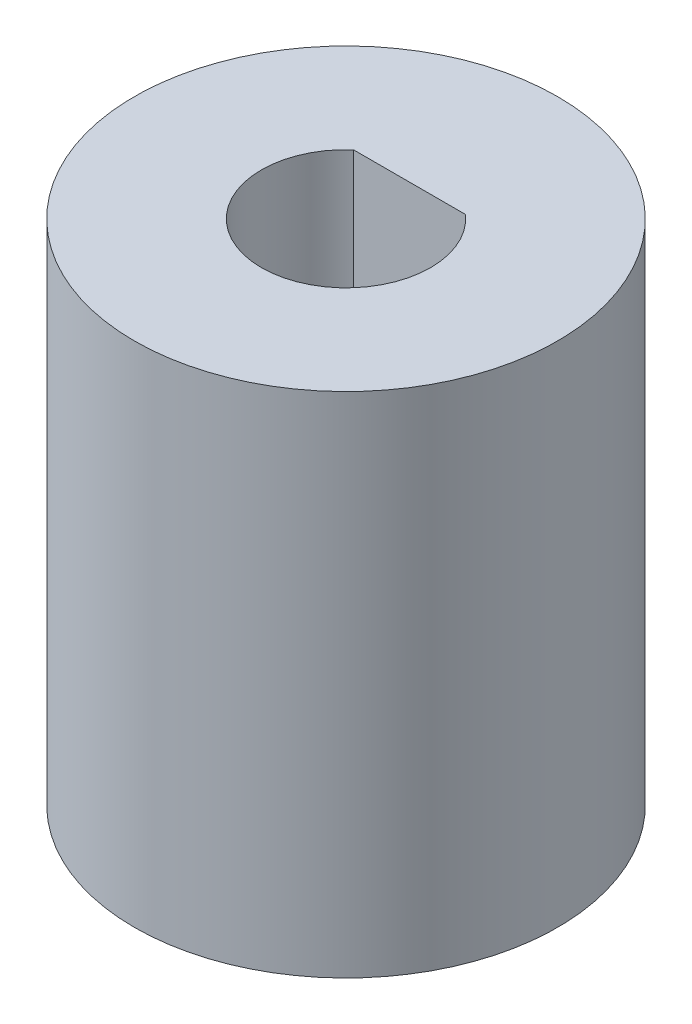
ISO-10303-21;
HEADER;
FILE_DESCRIPTION(('STEP AP214'),'2;1');
FILE_NAME('part.step','',(''),(''),'','','');
FILE_SCHEMA(('AUTOMOTIVE_DESIGN { 1 0 10303 214 1 1 1 1 }'));
ENDSEC;
DATA;
#1=APPLICATION_CONTEXT('core data for automotive mechanical design processes');
#2=APPLICATION_PROTOCOL_DEFINITION('international standard','automotive_design',2000,#1);
#3=PRODUCT_CONTEXT('',#1,'mechanical');
#4=PRODUCT('Part','Part','',(#3));
#5=PRODUCT_RELATED_PRODUCT_CATEGORY('part','',(#4));
#6=PRODUCT_DEFINITION_FORMATION('','',#4);
#7=PRODUCT_DEFINITION_CONTEXT('part definition',#1,'design');
#8=PRODUCT_DEFINITION('design','',#6,#7);
#9=PRODUCT_DEFINITION_SHAPE('','',#8);
#10=(LENGTH_UNIT() NAMED_UNIT(*) SI_UNIT(.MILLI.,.METRE.));
#11=(NAMED_UNIT(*) PLANE_ANGLE_UNIT() SI_UNIT($,.RADIAN.));
#12=(NAMED_UNIT(*) SI_UNIT($,.STERADIAN.) SOLID_ANGLE_UNIT());
#13=UNCERTAINTY_MEASURE_WITH_UNIT(LENGTH_MEASURE(1.E-05),#10,'distance_accuracy_value','');
#14=(GEOMETRIC_REPRESENTATION_CONTEXT(3) GLOBAL_UNCERTAINTY_ASSIGNED_CONTEXT((#13)) GLOBAL_UNIT_ASSIGNED_CONTEXT((#10,
#11,#12)) REPRESENTATION_CONTEXT('',''));
#15=CARTESIAN_POINT('',(0.,0.,0.));
#16=DIRECTION('',(0.,0.,1.));
#17=DIRECTION('',(1.,0.,0.));
#18=AXIS2_PLACEMENT_3D('',#15,#16,#17);
#19=CARTESIAN_POINT('',(0.,12.,0.));
#20=DIRECTION('',(0.,1.,0.));
#21=DIRECTION('',(0.,0.,1.));
#22=AXIS2_PLACEMENT_3D('',#19,#20,#21);
#23=PLANE('',#22);
#24=CARTESIAN_POINT('',(0.,12.,0.));
#25=DIRECTION('',(0.,1.,0.));
#26=DIRECTION('',(0.,0.,1.));
#27=AXIS2_PLACEMENT_3D('',#24,#25,#26);
#28=CIRCLE('',#27,5.);
#29=CARTESIAN_POINT('',(0.,12.,5.));
#30=VERTEX_POINT('',#29);
#31=EDGE_CURVE('E11',#30,#30,#28,.T.);
#32=ORIENTED_EDGE('',*,*,#31,.T.);
#33=EDGE_LOOP('',(#32));
#34=FACE_BOUND('',#33,.T.);
#35=DIRECTION('',(-1.,0.,0.));
#36=VECTOR('',#35,1.);
#37=CARTESIAN_POINT('',(-1.3228756555323,12.,-1.5));
#38=LINE('',#37,#36);
#39=CARTESIAN_POINT('',(1.3228756555323,12.,-1.5));
#40=VERTEX_POINT('',#39);
#41=CARTESIAN_POINT('',(-1.3228756555323,12.,-1.5));
#42=VERTEX_POINT('',#41);
#43=EDGE_CURVE('E83',#40,#42,#38,.T.);
#44=ORIENTED_EDGE('',*,*,#43,.F.);
#45=CARTESIAN_POINT('',(0.,12.,0.));
#46=DIRECTION('',(0.,1.,0.));
#47=DIRECTION('',(0.,0.,1.));
#48=AXIS2_PLACEMENT_3D('',#45,#46,#47);
#49=CIRCLE('',#48,2.);
#50=EDGE_CURVE('E70',#42,#40,#49,.T.);
#51=ORIENTED_EDGE('',*,*,#50,.F.);
#52=EDGE_LOOP('',(#44,#51));
#53=FACE_BOUND('',#52,.T.);
#54=ADVANCED_FACE('F37',(#34,#53),#23,.T.);
#55=CARTESIAN_POINT('',(0.,0.,0.));
#56=DIRECTION('',(0.,1.,0.));
#57=DIRECTION('',(0.,0.,1.));
#58=AXIS2_PLACEMENT_3D('',#55,#56,#57);
#59=PLANE('',#58);
#60=CARTESIAN_POINT('',(0.,0.,0.));
#61=DIRECTION('',(0.,1.,0.));
#62=DIRECTION('',(0.,0.,1.));
#63=AXIS2_PLACEMENT_3D('',#60,#61,#62);
#64=CIRCLE('',#63,5.);
#65=CARTESIAN_POINT('',(0.,0.,5.));
#66=VERTEX_POINT('',#65);
#67=EDGE_CURVE('E42',#66,#66,#64,.T.);
#68=ORIENTED_EDGE('',*,*,#67,.F.);
#69=EDGE_LOOP('',(#68));
#70=FACE_BOUND('',#69,.T.);
#71=CARTESIAN_POINT('',(0.,0.,0.));
#72=DIRECTION('',(0.,1.,0.));
#73=DIRECTION('',(0.,0.,1.));
#74=AXIS2_PLACEMENT_3D('',#71,#72,#73);
#75=CIRCLE('',#74,2.);
#76=CARTESIAN_POINT('',(-1.3228756555323,0.,-1.5));
#77=VERTEX_POINT('',#76);
#78=CARTESIAN_POINT('',(1.3228756555323,0.,-1.5));
#79=VERTEX_POINT('',#78);
#80=EDGE_CURVE('E60',#77,#79,#75,.T.);
#81=ORIENTED_EDGE('',*,*,#80,.T.);
#82=DIRECTION('',(-1.,0.,0.));
#83=VECTOR('',#82,1.);
#84=CARTESIAN_POINT('',(-1.3228756555323,0.,-1.5));
#85=LINE('',#84,#83);
#86=EDGE_CURVE('E66',#79,#77,#85,.T.);
#87=ORIENTED_EDGE('',*,*,#86,.T.);
#88=EDGE_LOOP('',(#81,#87));
#89=FACE_BOUND('',#88,.T.);
#90=ADVANCED_FACE('F76',(#70,#89),#59,.F.);
#91=CARTESIAN_POINT('',(0.,12.,0.));
#92=DIRECTION('',(0.,-1.,0.));
#93=DIRECTION('',(0.,0.,-1.));
#94=AXIS2_PLACEMENT_3D('',#91,#92,#93);
#95=CYLINDRICAL_SURFACE('',#94,5.);
#96=CARTESIAN_POINT('',(0.,6.99683665740258,-5.));
#97=CARTESIAN_POINT('',(-0.0555769067926332,6.99683461290424,-4.99999897580871));
#98=CARTESIAN_POINT('',(-0.111179660201522,6.99218781443494,-4.99906385178231));
#99=CARTESIAN_POINT('',(-0.220813507689019,6.97373815728734,-4.99542365623231));
#100=CARTESIAN_POINT('',(-0.274843317541356,6.95992802460107,-4.99271717860186));
#101=CARTESIAN_POINT('',(-0.379730305263313,6.92359538378179,-4.98583649278287));
#102=CARTESIAN_POINT('',(-0.430590467933134,6.9010812205579,-4.98166369076718));
#103=CARTESIAN_POINT('',(-0.527807988864226,6.84800440989129,-4.97230398035314));
#104=CARTESIAN_POINT('',(-0.574165615075812,6.81744224179538,-4.96711713235707));
#105=CARTESIAN_POINT('',(-0.661693477314865,6.74869816311115,-4.9562216532997));
#106=CARTESIAN_POINT('',(-0.702793951158524,6.71042830201138,-4.95050745504347));
#107=CARTESIAN_POINT('',(-0.778036756608028,6.62754424101088,-4.93924180452588));
#108=CARTESIAN_POINT('',(-0.812178544770424,6.58292954606746,-4.93369036500424));
#109=CARTESIAN_POINT('',(-0.87283175334762,6.48812046439071,-4.92332441812615));
#110=CARTESIAN_POINT('',(-0.899270938865866,6.43787901360622,-4.91851707364946));
#111=CARTESIAN_POINT('',(-0.943305666580308,6.3335548383985,-4.91026268058418));
#112=CARTESIAN_POINT('',(-0.960902082437238,6.27947249405624,-4.90681549761962));
#113=CARTESIAN_POINT('',(-0.986525299884827,6.16975229349467,-4.90172805252205));
#114=CARTESIAN_POINT('',(-0.994674497958777,6.11414411326036,-4.90006470107188));
#115=CARTESIAN_POINT('',(-1.00155212772612,6.00232683603824,-4.89866375060627));
#116=CARTESIAN_POINT('',(-1.0002815227135,5.94611780108244,-4.89892595467841));
#117=CARTESIAN_POINT('',(-0.988454573101819,5.83558986938158,-4.90132551148185));
#118=CARTESIAN_POINT('',(-0.978038540243905,5.78125525177527,-4.90343452858764));
#119=CARTESIAN_POINT('',(-0.94843788462305,5.67512058073958,-4.90924546160001));
#120=CARTESIAN_POINT('',(-0.929252843100681,5.62332064848357,-4.91294745357779));
#121=CARTESIAN_POINT('',(-0.88252478367472,5.52332139569898,-4.92155618500408));
#122=CARTESIAN_POINT('',(-0.854926151232115,5.47514877783341,-4.92647089813704));
#123=CARTESIAN_POINT('',(-0.792193574572679,5.38406580742977,-4.93694618773062));
#124=CARTESIAN_POINT('',(-0.757058764356829,5.34115606055143,-4.94250683838366));
#125=CARTESIAN_POINT('',(-0.679499934560585,5.26100725494565,-4.95377021241462));
#126=CARTESIAN_POINT('',(-0.636956161212446,5.22388408954345,-4.95947369210905));
#127=CARTESIAN_POINT('',(-0.546185024062011,5.15728281110136,-4.97028848714409));
#128=CARTESIAN_POINT('',(-0.49795758737939,5.127804796109,-4.97539979488974));
#129=CARTESIAN_POINT('',(-0.397059386878922,5.07730914817661,-4.98446690160887));
#130=CARTESIAN_POINT('',(-0.344381819585301,5.05630476375805,-4.98842088848272));
#131=CARTESIAN_POINT('',(-0.236148976448666,5.02347618336402,-4.99471408987858));
#132=CARTESIAN_POINT('',(-0.18059405007245,5.01165087532895,-4.99705350000531));
#133=CARTESIAN_POINT('',(-0.0691794056271512,4.9976802036083,-4.99982671866868));
#134=CARTESIAN_POINT('',(-0.0133403283255769,4.99537623786231,-5.0002917465247));
#135=CARTESIAN_POINT('',(0.0979249341927135,5.00008651634476,-4.99935051930103));
#136=CARTESIAN_POINT('',(0.153351142443793,5.00710023675518,-4.99794436941446));
#137=CARTESIAN_POINT('',(0.26170565994654,5.03011503094654,-4.99343832008018));
#138=CARTESIAN_POINT('',(0.314651948339902,5.04603472590049,-4.99035376404206));
#139=CARTESIAN_POINT('',(0.417123627499666,5.08632064005839,-4.98283552061033));
#140=CARTESIAN_POINT('',(0.466648761637539,5.11068749207941,-4.97840173214227));
#141=CARTESIAN_POINT('',(0.561541173686217,5.16751914805389,-4.96859911533295));
#142=CARTESIAN_POINT('',(0.606850126752187,5.20007943844153,-4.96321950437052));
#143=CARTESIAN_POINT('',(0.691418019119206,5.27224584860986,-4.95214734829882));
#144=CARTESIAN_POINT('',(0.730676308930762,5.31185272380245,-4.94645476968388));
#145=CARTESIAN_POINT('',(0.802640590774175,5.39771000929371,-4.93529303556965));
#146=CARTESIAN_POINT('',(0.835237702448655,5.44405240162392,-4.92982860233304));
#147=CARTESIAN_POINT('',(0.892185420051205,5.54164801875926,-4.91984191796194));
#148=CARTESIAN_POINT('',(0.916536355922902,5.59290104697613,-4.91531962913343));
#149=CARTESIAN_POINT('',(0.95615184158196,5.69860490355213,-4.90776740584383));
#150=CARTESIAN_POINT('',(0.971463499791051,5.7530374986129,-4.90472974872187));
#151=CARTESIAN_POINT('',(0.992708651627196,5.86377011089349,-4.90047436792025));
#152=CARTESIAN_POINT('',(0.998643368225112,5.92006988361193,-4.89925640691112));
#153=CARTESIAN_POINT('',(1.00092091086747,6.0318455219469,-4.89879149631379));
#154=CARTESIAN_POINT('',(0.997435788070896,6.08731780632959,-4.89950919189301));
#155=CARTESIAN_POINT('',(0.981352304100061,6.19686830730761,-4.90275573484614));
#156=CARTESIAN_POINT('',(0.968754016129298,6.25094653509739,-4.90528456767169));
#157=CARTESIAN_POINT('',(0.934878568498954,6.35606436864313,-4.91185264219159));
#158=CARTESIAN_POINT('',(0.913622506717345,6.407111017905,-4.91588821018831));
#159=CARTESIAN_POINT('',(0.863054644601605,6.50494037813702,-4.9250171497417));
#160=CARTESIAN_POINT('',(0.833742168774883,6.55172273112772,-4.93011060998894));
#161=CARTESIAN_POINT('',(0.767305914786415,6.6405522295529,-4.94088960523225));
#162=CARTESIAN_POINT('',(0.730057887235181,6.68250542267018,-4.946583729097));
#163=CARTESIAN_POINT('',(0.649064369013142,6.75962286293175,-4.95786081871955));
#164=CARTESIAN_POINT('',(0.605317387153336,6.79478554771985,-4.96344375863184));
#165=CARTESIAN_POINT('',(0.512017629088248,6.85767130134903,-4.97393832387971));
#166=CARTESIAN_POINT('',(0.462408884429836,6.88531266068261,-4.97884231219246));
#167=CARTESIAN_POINT('',(0.359166360940734,6.93182277999917,-4.98735125085));
#168=CARTESIAN_POINT('',(0.305536260863127,6.95069944693507,-4.99095737138616));
#169=CARTESIAN_POINT('',(0.20982148892378,6.9754886054473,-4.99576372595371));
#170=CARTESIAN_POINT('',(0.168281664013785,6.98347985111034,-4.99734303158452));
#171=CARTESIAN_POINT('',(0.0844995252100669,6.99415456976095,-4.99946154139893));
#172=CARTESIAN_POINT('',(0.042257233748619,6.99683821191235,-5.00000077873155));
#173=CARTESIAN_POINT('',(0.,6.99683665740258,-5.));
#174=B_SPLINE_CURVE_WITH_KNOTS('',3,(#96,#97,#98,#99,#100,#101,#102,#103,#104,#105,#106,#107,
#108,#109,#110,#111,#112,#113,#114,#115,#116,#117,#118,#119,#120,#121,#122,#123,#124,#125,#126,
#127,#128,#129,#130,#131,#132,#133,#134,#135,#136,#137,#138,#139,#140,#141,#142,#143,#144,#145,
#146,#147,#148,#149,#150,#151,#152,#153,#154,#155,#156,#157,#158,#159,#160,#161,#162,#163,#164,
#165,#166,#167,#168,#169,#170,#171,#172,#173),.UNSPECIFIED.,.T.,.F.,(4,2,2,2,2,2,2,2,2,2,2,2,2,
2,2,2,2,2,2,2,2,2,2,2,2,2,2,2,2,2,2,2,2,2,2,2,2,2,4),(0.,0.166576130661258,0.333284650691323,
0.499833735250342,0.666372902230863,0.834932670112186,1.00350559674737,1.17361195005923,
1.34370149365197,1.51156185103587,1.67940504281225,1.84471727006278,2.0100373925373,
2.17647490203592,2.3429315474967,2.51238252491351,2.6818356753982,2.85155274854024,
3.02124925698036,3.18810735676265,3.35495607657868,3.52030453950723,3.68566539216022,
3.85305066033359,4.0204538834593,4.19040628579226,4.36035188723466,4.52940381032723,
4.69843368330415,4.86439722567701,5.03035943492608,5.1959196125311,5.36149367581866,
5.52988076239143,5.6983065453293,5.86849496675637,6.03852955517519,6.16518775289894,
6.29184191370996),.UNSPECIFIED.);
#175=CARTESIAN_POINT('',(0.,6.99683665740258,-5.));
#176=VERTEX_POINT('',#175);
#177=EDGE_CURVE('E77',#176,#176,#174,.T.);
#178=ORIENTED_EDGE('',*,*,#177,.T.);
#179=EDGE_LOOP('',(#178));
#180=FACE_BOUND('',#179,.T.);
#181=ORIENTED_EDGE('',*,*,#31,.F.);
#182=EDGE_LOOP('',(#181));
#183=FACE_BOUND('',#182,.T.);
#184=ORIENTED_EDGE('',*,*,#67,.T.);
#185=EDGE_LOOP('',(#184));
#186=FACE_BOUND('',#185,.T.);
#187=ADVANCED_FACE('F39',(#180,#183,#186),#95,.T.);
#188=CARTESIAN_POINT('',(0.,12.,0.));
#189=DIRECTION('',(0.,-1.,0.));
#190=DIRECTION('',(0.,0.,-1.));
#191=AXIS2_PLACEMENT_3D('',#188,#189,#190);
#192=CYLINDRICAL_SURFACE('',#191,2.);
#193=ORIENTED_EDGE('',*,*,#80,.F.);
#194=DIRECTION('',(0.,-1.,0.));
#195=VECTOR('',#194,1.);
#196=CARTESIAN_POINT('',(-1.3228756555323,12.,-1.5));
#197=LINE('',#196,#195);
#198=EDGE_CURVE('E68',#42,#77,#197,.T.);
#199=ORIENTED_EDGE('',*,*,#198,.F.);
#200=ORIENTED_EDGE('',*,*,#50,.T.);
#201=DIRECTION('',(0.,-1.,0.));
#202=VECTOR('',#201,1.);
#203=CARTESIAN_POINT('',(1.3228756555323,12.,-1.5));
#204=LINE('',#203,#202);
#205=EDGE_CURVE('E53',#40,#79,#204,.T.);
#206=ORIENTED_EDGE('',*,*,#205,.T.);
#207=EDGE_LOOP('',(#193,#199,#200,#206));
#208=FACE_BOUND('',#207,.T.);
#209=ADVANCED_FACE('F72',(#208),#192,.F.);
#210=CARTESIAN_POINT('',(-1.3228756555323,12.,-1.5));
#211=DIRECTION('',(0.,0.,1.));
#212=DIRECTION('',(1.,0.,0.));
#213=AXIS2_PLACEMENT_3D('',#210,#211,#212);
#214=PLANE('',#213);
#215=CARTESIAN_POINT('',(0.,5.99683665740258,-1.5));
#216=DIRECTION('',(0.,0.,1.));
#217=DIRECTION('',(1.,0.,0.));
#218=AXIS2_PLACEMENT_3D('',#215,#216,#217);
#219=CIRCLE('',#218,1.);
#220=CARTESIAN_POINT('',(1.,5.99683665740258,-1.5));
#221=VERTEX_POINT('',#220);
#222=EDGE_CURVE('E80',#221,#221,#219,.T.);
#223=ORIENTED_EDGE('',*,*,#222,.F.);
#224=EDGE_LOOP('',(#223));
#225=FACE_BOUND('',#224,.T.);
#226=ORIENTED_EDGE('',*,*,#86,.F.);
#227=ORIENTED_EDGE('',*,*,#205,.F.);
#228=ORIENTED_EDGE('',*,*,#43,.T.);
#229=ORIENTED_EDGE('',*,*,#198,.T.);
#230=EDGE_LOOP('',(#226,#227,#228,#229));
#231=FACE_BOUND('',#230,.T.);
#232=ADVANCED_FACE('F67',(#225,#231),#214,.T.);
#233=CARTESIAN_POINT('',(0.,5.99683665740258,-13.5));
#234=DIRECTION('',(0.,0.,1.));
#235=DIRECTION('',(1.,0.,0.));
#236=AXIS2_PLACEMENT_3D('',#233,#234,#235);
#237=CYLINDRICAL_SURFACE('',#236,1.);
#238=ORIENTED_EDGE('',*,*,#222,.T.);
#239=EDGE_LOOP('',(#238));
#240=FACE_BOUND('',#239,.T.);
#241=ORIENTED_EDGE('',*,*,#177,.F.);
#242=EDGE_LOOP('',(#241));
#243=FACE_BOUND('',#242,.T.);
#244=ADVANCED_FACE('F90',(#240,#243),#237,.F.);
#245=CLOSED_SHELL('',(#54,#90,#187,#209,#232,#244));
#246=MANIFOLD_SOLID_BREP('B2',#245);
#247=ADVANCED_BREP_SHAPE_REPRESENTATION('',(#18,#246),#14);
#248=SHAPE_DEFINITION_REPRESENTATION(#9,#247);
ENDSEC;
END-ISO-10303-21;
